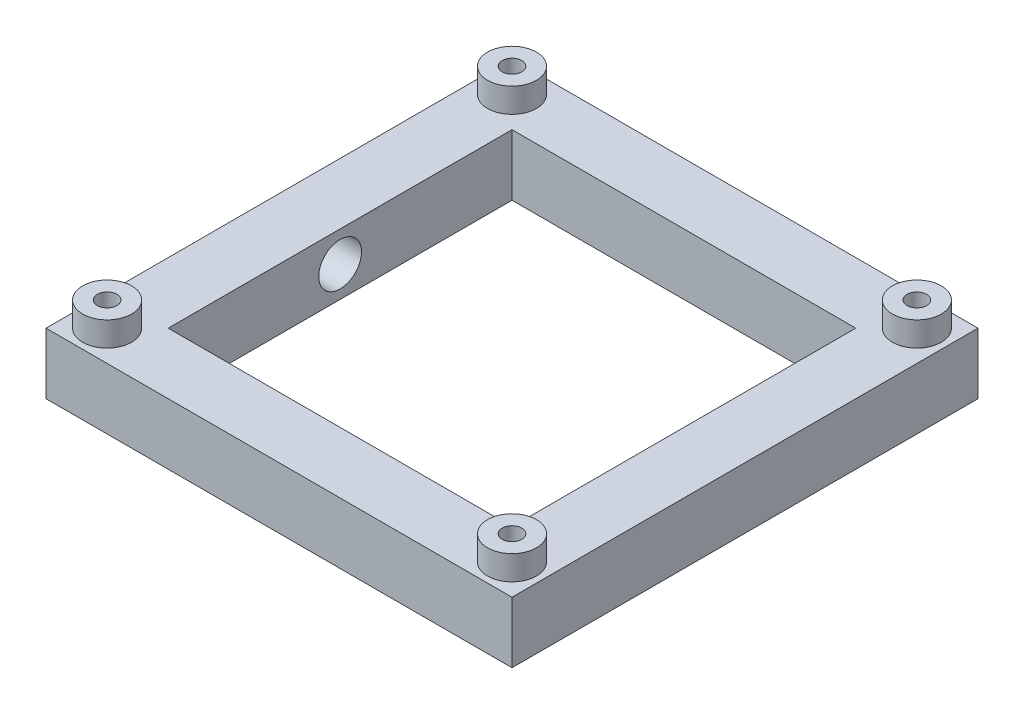
ISO-10303-21;
HEADER;
FILE_DESCRIPTION(('STEP AP214'),'2;1');
FILE_NAME('part.step','',(''),(''),'','','');
FILE_SCHEMA(('AUTOMOTIVE_DESIGN { 1 0 10303 214 1 1 1 1 }'));
ENDSEC;
DATA;
#1=APPLICATION_CONTEXT('core data for automotive mechanical design processes');
#2=APPLICATION_PROTOCOL_DEFINITION('international standard','automotive_design',2000,#1);
#3=PRODUCT_CONTEXT('',#1,'mechanical');
#4=PRODUCT('Part','Part','',(#3));
#5=PRODUCT_RELATED_PRODUCT_CATEGORY('part','',(#4));
#6=PRODUCT_DEFINITION_FORMATION('','',#4);
#7=PRODUCT_DEFINITION_CONTEXT('part definition',#1,'design');
#8=PRODUCT_DEFINITION('design','',#6,#7);
#9=PRODUCT_DEFINITION_SHAPE('','',#8);
#10=(LENGTH_UNIT() NAMED_UNIT(*) SI_UNIT(.MILLI.,.METRE.));
#11=(NAMED_UNIT(*) PLANE_ANGLE_UNIT() SI_UNIT($,.RADIAN.));
#12=(NAMED_UNIT(*) SI_UNIT($,.STERADIAN.) SOLID_ANGLE_UNIT());
#13=UNCERTAINTY_MEASURE_WITH_UNIT(LENGTH_MEASURE(1.E-05),#10,'distance_accuracy_value','');
#14=(GEOMETRIC_REPRESENTATION_CONTEXT(3) GLOBAL_UNCERTAINTY_ASSIGNED_CONTEXT((#13)) GLOBAL_UNIT_ASSIGNED_CONTEXT((#10,
#11,#12)) REPRESENTATION_CONTEXT('',''));
#15=CARTESIAN_POINT('',(0.,0.,0.));
#16=DIRECTION('',(0.,0.,1.));
#17=DIRECTION('',(1.,0.,0.));
#18=AXIS2_PLACEMENT_3D('',#15,#16,#17);
#19=CARTESIAN_POINT('',(0.,10.,0.));
#20=DIRECTION('',(0.,1.,0.));
#21=DIRECTION('',(0.,0.,1.));
#22=AXIS2_PLACEMENT_3D('',#19,#20,#21);
#23=PLANE('',#22);
#24=CARTESIAN_POINT('',(61.25,10.,61.25));
#25=DIRECTION('',(0.,1.,0.));
#26=DIRECTION('',(0.,0.,1.));
#27=AXIS2_PLACEMENT_3D('',#24,#25,#26);
#28=CIRCLE('',#27,4.00000000000001);
#29=CARTESIAN_POINT('',(61.25,10.,65.25));
#30=VERTEX_POINT('',#29);
#31=EDGE_CURVE('E245',#30,#30,#28,.T.);
#32=ORIENTED_EDGE('',*,*,#31,.F.);
#33=EDGE_LOOP('',(#32));
#34=FACE_BOUND('',#33,.T.);
#35=CARTESIAN_POINT('',(-5.,10.,-5.));
#36=DIRECTION('',(0.,1.,0.));
#37=DIRECTION('',(0.,0.,1.));
#38=AXIS2_PLACEMENT_3D('',#35,#36,#37);
#39=CIRCLE('',#38,4.);
#40=CARTESIAN_POINT('',(-5.,10.,-1.));
#41=VERTEX_POINT('',#40);
#42=EDGE_CURVE('E227',#41,#41,#39,.T.);
#43=ORIENTED_EDGE('',*,*,#42,.F.);
#44=EDGE_LOOP('',(#43));
#45=FACE_BOUND('',#44,.T.);
#46=DIRECTION('',(0.,0.,1.));
#47=VECTOR('',#46,1.);
#48=CARTESIAN_POINT('',(66.25,10.,0.));
#49=LINE('',#48,#47);
#50=CARTESIAN_POINT('',(66.25,10.,-10.));
#51=VERTEX_POINT('',#50);
#52=CARTESIAN_POINT('',(66.25,10.,66.25));
#53=VERTEX_POINT('',#52);
#54=EDGE_CURVE('E187',#51,#53,#49,.T.);
#55=ORIENTED_EDGE('',*,*,#54,.F.);
#56=DIRECTION('',(1.,0.,0.));
#57=VECTOR('',#56,1.);
#58=CARTESIAN_POINT('',(0.,10.,-10.));
#59=LINE('',#58,#57);
#60=CARTESIAN_POINT('',(-10.,10.,-10.));
#61=VERTEX_POINT('',#60);
#62=EDGE_CURVE('E202',#61,#51,#59,.T.);
#63=ORIENTED_EDGE('',*,*,#62,.F.);
#64=DIRECTION('',(0.,0.,1.));
#65=VECTOR('',#64,1.);
#66=CARTESIAN_POINT('',(-10.,10.,0.));
#67=LINE('',#66,#65);
#68=CARTESIAN_POINT('',(-9.99999999999999,10.,66.25));
#69=VERTEX_POINT('',#68);
#70=EDGE_CURVE('E215',#61,#69,#67,.T.);
#71=ORIENTED_EDGE('',*,*,#70,.T.);
#72=DIRECTION('',(1.,0.,0.));
#73=VECTOR('',#72,1.);
#74=CARTESIAN_POINT('',(0.,10.,66.25));
#75=LINE('',#74,#73);
#76=EDGE_CURVE('E213',#69,#53,#75,.T.);
#77=ORIENTED_EDGE('',*,*,#76,.T.);
#78=EDGE_LOOP('',(#55,#63,#71,#77));
#79=FACE_BOUND('',#78,.T.);
#80=DIRECTION('',(1.,0.,0.));
#81=VECTOR('',#80,1.);
#82=CARTESIAN_POINT('',(0.,10.,0.));
#83=LINE('',#82,#81);
#84=CARTESIAN_POINT('',(0.,10.,0.));
#85=VERTEX_POINT('',#84);
#86=CARTESIAN_POINT('',(56.25,10.,0.));
#87=VERTEX_POINT('',#86);
#88=EDGE_CURVE('E138',#85,#87,#83,.T.);
#89=ORIENTED_EDGE('',*,*,#88,.T.);
#90=DIRECTION('',(0.,0.,1.));
#91=VECTOR('',#90,1.);
#92=CARTESIAN_POINT('',(56.25,10.,0.));
#93=LINE('',#92,#91);
#94=CARTESIAN_POINT('',(56.25,10.,56.25));
#95=VERTEX_POINT('',#94);
#96=EDGE_CURVE('E132',#87,#95,#93,.T.);
#97=ORIENTED_EDGE('',*,*,#96,.T.);
#98=DIRECTION('',(1.,0.,0.));
#99=VECTOR('',#98,1.);
#100=CARTESIAN_POINT('',(0.,10.,56.25));
#101=LINE('',#100,#99);
#102=CARTESIAN_POINT('',(0.,10.,56.25));
#103=VERTEX_POINT('',#102);
#104=EDGE_CURVE('E137',#103,#95,#101,.T.);
#105=ORIENTED_EDGE('',*,*,#104,.F.);
#106=DIRECTION('',(0.,0.,1.));
#107=VECTOR('',#106,1.);
#108=CARTESIAN_POINT('',(0.,10.,0.));
#109=LINE('',#108,#107);
#110=EDGE_CURVE('E149',#85,#103,#109,.T.);
#111=ORIENTED_EDGE('',*,*,#110,.F.);
#112=EDGE_LOOP('',(#89,#97,#105,#111));
#113=FACE_BOUND('',#112,.T.);
#114=CARTESIAN_POINT('',(-4.99999999999999,10.,61.25));
#115=DIRECTION('',(0.,1.,0.));
#116=DIRECTION('',(0.,0.,1.));
#117=AXIS2_PLACEMENT_3D('',#114,#115,#116);
#118=CIRCLE('',#117,4.);
#119=CARTESIAN_POINT('',(-4.99999999999999,10.,65.25));
#120=VERTEX_POINT('',#119);
#121=EDGE_CURVE('E236',#120,#120,#118,.T.);
#122=ORIENTED_EDGE('',*,*,#121,.F.);
#123=EDGE_LOOP('',(#122));
#124=FACE_BOUND('',#123,.T.);
#125=CARTESIAN_POINT('',(61.25,10.,-5.));
#126=DIRECTION('',(0.,1.,0.));
#127=DIRECTION('',(0.,0.,1.));
#128=AXIS2_PLACEMENT_3D('',#125,#126,#127);
#129=CIRCLE('',#128,4.);
#130=CARTESIAN_POINT('',(61.25,10.,-1.));
#131=VERTEX_POINT('',#130);
#132=EDGE_CURVE('E254',#131,#131,#129,.T.);
#133=ORIENTED_EDGE('',*,*,#132,.F.);
#134=EDGE_LOOP('',(#133));
#135=FACE_BOUND('',#134,.T.);
#136=ADVANCED_FACE('F59',(#34,#45,#79,#113,#124,#135),#23,.T.);
#137=CARTESIAN_POINT('',(0.,10.,0.));
#138=DIRECTION('',(0.,0.,-1.));
#139=DIRECTION('',(-1.,0.,0.));
#140=AXIS2_PLACEMENT_3D('',#137,#138,#139);
#141=PLANE('',#140);
#142=DIRECTION('',(1.,0.,0.));
#143=VECTOR('',#142,1.);
#144=CARTESIAN_POINT('',(0.,0.,0.));
#145=LINE('',#144,#143);
#146=CARTESIAN_POINT('',(0.,0.,0.));
#147=VERTEX_POINT('',#146);
#148=CARTESIAN_POINT('',(56.25,0.,0.));
#149=VERTEX_POINT('',#148);
#150=EDGE_CURVE('E167',#147,#149,#145,.T.);
#151=ORIENTED_EDGE('',*,*,#150,.T.);
#152=DIRECTION('',(0.,-1.,0.));
#153=VECTOR('',#152,1.);
#154=CARTESIAN_POINT('',(56.25,10.,0.));
#155=LINE('',#154,#153);
#156=EDGE_CURVE('E12',#87,#149,#155,.T.);
#157=ORIENTED_EDGE('',*,*,#156,.F.);
#158=ORIENTED_EDGE('',*,*,#88,.F.);
#159=DIRECTION('',(0.,-1.,0.));
#160=VECTOR('',#159,1.);
#161=CARTESIAN_POINT('',(0.,10.,0.));
#162=LINE('',#161,#160);
#163=EDGE_CURVE('E78',#85,#147,#162,.T.);
#164=ORIENTED_EDGE('',*,*,#163,.T.);
#165=EDGE_LOOP('',(#151,#157,#158,#164));
#166=FACE_BOUND('',#165,.T.);
#167=ADVANCED_FACE('F281',(#166),#141,.F.);
#168=CARTESIAN_POINT('',(56.25,10.,0.));
#169=DIRECTION('',(1.,0.,0.));
#170=DIRECTION('',(0.,0.,-1.));
#171=AXIS2_PLACEMENT_3D('',#168,#169,#170);
#172=PLANE('',#171);
#173=DIRECTION('',(0.,0.,1.));
#174=VECTOR('',#173,1.);
#175=CARTESIAN_POINT('',(56.25,0.,0.));
#176=LINE('',#175,#174);
#177=CARTESIAN_POINT('',(56.25,0.,56.25));
#178=VERTEX_POINT('',#177);
#179=EDGE_CURVE('E144',#149,#178,#176,.T.);
#180=ORIENTED_EDGE('',*,*,#179,.T.);
#181=DIRECTION('',(0.,-1.,0.));
#182=VECTOR('',#181,1.);
#183=CARTESIAN_POINT('',(56.25,10.,56.25));
#184=LINE('',#183,#182);
#185=EDGE_CURVE('E69',#95,#178,#184,.T.);
#186=ORIENTED_EDGE('',*,*,#185,.F.);
#187=ORIENTED_EDGE('',*,*,#96,.F.);
#188=ORIENTED_EDGE('',*,*,#156,.T.);
#189=EDGE_LOOP('',(#180,#186,#187,#188));
#190=FACE_BOUND('',#189,.T.);
#191=ADVANCED_FACE('F143',(#190),#172,.F.);
#192=CARTESIAN_POINT('',(0.,10.,56.25));
#193=DIRECTION('',(0.,0.,-1.));
#194=DIRECTION('',(-1.,0.,0.));
#195=AXIS2_PLACEMENT_3D('',#192,#193,#194);
#196=PLANE('',#195);
#197=DIRECTION('',(1.,0.,0.));
#198=VECTOR('',#197,1.);
#199=CARTESIAN_POINT('',(0.,0.,56.25));
#200=LINE('',#199,#198);
#201=CARTESIAN_POINT('',(0.,0.,56.25));
#202=VERTEX_POINT('',#201);
#203=EDGE_CURVE('E170',#202,#178,#200,.T.);
#204=ORIENTED_EDGE('',*,*,#203,.F.);
#205=DIRECTION('',(0.,-1.,0.));
#206=VECTOR('',#205,1.);
#207=CARTESIAN_POINT('',(0.,10.,56.25));
#208=LINE('',#207,#206);
#209=EDGE_CURVE('E104',#103,#202,#208,.T.);
#210=ORIENTED_EDGE('',*,*,#209,.F.);
#211=ORIENTED_EDGE('',*,*,#104,.T.);
#212=ORIENTED_EDGE('',*,*,#185,.T.);
#213=EDGE_LOOP('',(#204,#210,#211,#212));
#214=FACE_BOUND('',#213,.T.);
#215=ADVANCED_FACE('F148',(#214),#196,.T.);
#216=CARTESIAN_POINT('',(66.25,10.,0.));
#217=DIRECTION('',(1.,0.,0.));
#218=DIRECTION('',(0.,0.,-1.));
#219=AXIS2_PLACEMENT_3D('',#216,#217,#218);
#220=PLANE('',#219);
#221=DIRECTION('',(0.,0.,1.));
#222=VECTOR('',#221,1.);
#223=CARTESIAN_POINT('',(66.25,0.,0.));
#224=LINE('',#223,#222);
#225=CARTESIAN_POINT('',(66.25,0.,-10.));
#226=VERTEX_POINT('',#225);
#227=CARTESIAN_POINT('',(66.25,0.,66.25));
#228=VERTEX_POINT('',#227);
#229=EDGE_CURVE('E155',#226,#228,#224,.T.);
#230=ORIENTED_EDGE('',*,*,#229,.F.);
#231=DIRECTION('',(0.,-1.,0.));
#232=VECTOR('',#231,1.);
#233=CARTESIAN_POINT('',(66.25,10.,-10.));
#234=LINE('',#233,#232);
#235=EDGE_CURVE('E63',#51,#226,#234,.T.);
#236=ORIENTED_EDGE('',*,*,#235,.F.);
#237=ORIENTED_EDGE('',*,*,#54,.T.);
#238=DIRECTION('',(0.,-1.,0.));
#239=VECTOR('',#238,1.);
#240=CARTESIAN_POINT('',(66.25,10.,66.25));
#241=LINE('',#240,#239);
#242=EDGE_CURVE('E151',#53,#228,#241,.T.);
#243=ORIENTED_EDGE('',*,*,#242,.T.);
#244=EDGE_LOOP('',(#230,#236,#237,#243));
#245=FACE_BOUND('',#244,.T.);
#246=ADVANCED_FACE('F61',(#245),#220,.T.);
#247=CARTESIAN_POINT('',(0.,10.,-10.));
#248=DIRECTION('',(0.,0.,-1.));
#249=DIRECTION('',(-1.,0.,0.));
#250=AXIS2_PLACEMENT_3D('',#247,#248,#249);
#251=PLANE('',#250);
#252=DIRECTION('',(1.,0.,0.));
#253=VECTOR('',#252,1.);
#254=CARTESIAN_POINT('',(0.,0.,-10.));
#255=LINE('',#254,#253);
#256=CARTESIAN_POINT('',(-10.,0.,-10.));
#257=VERTEX_POINT('',#256);
#258=EDGE_CURVE('E158',#257,#226,#255,.T.);
#259=ORIENTED_EDGE('',*,*,#258,.F.);
#260=DIRECTION('',(0.,-1.,0.));
#261=VECTOR('',#260,1.);
#262=CARTESIAN_POINT('',(-10.,10.,-10.));
#263=LINE('',#262,#261);
#264=EDGE_CURVE('E193',#61,#257,#263,.T.);
#265=ORIENTED_EDGE('',*,*,#264,.F.);
#266=ORIENTED_EDGE('',*,*,#62,.T.);
#267=ORIENTED_EDGE('',*,*,#235,.T.);
#268=EDGE_LOOP('',(#259,#265,#266,#267));
#269=FACE_BOUND('',#268,.T.);
#270=ADVANCED_FACE('F200',(#269),#251,.T.);
#271=CARTESIAN_POINT('',(-10.,10.,0.));
#272=DIRECTION('',(1.,0.,0.));
#273=DIRECTION('',(0.,0.,-1.));
#274=AXIS2_PLACEMENT_3D('',#271,#272,#273);
#275=PLANE('',#274);
#276=CARTESIAN_POINT('',(-10.,5.00000000000019,28.125));
#277=DIRECTION('',(1.,0.,0.));
#278=DIRECTION('',(0.,0.,-1.));
#279=AXIS2_PLACEMENT_3D('',#276,#277,#278);
#280=CIRCLE('',#279,3.5);
#281=CARTESIAN_POINT('',(-10.,5.00000000000019,24.625));
#282=VERTEX_POINT('',#281);
#283=EDGE_CURVE('E159',#282,#282,#280,.F.);
#284=ORIENTED_EDGE('',*,*,#283,.F.);
#285=EDGE_LOOP('',(#284));
#286=FACE_BOUND('',#285,.T.);
#287=DIRECTION('',(0.,0.,1.));
#288=VECTOR('',#287,1.);
#289=CARTESIAN_POINT('',(-10.,0.,0.));
#290=LINE('',#289,#288);
#291=CARTESIAN_POINT('',(-9.99999999999999,0.,66.25));
#292=VERTEX_POINT('',#291);
#293=EDGE_CURVE('E162',#257,#292,#290,.T.);
#294=ORIENTED_EDGE('',*,*,#293,.T.);
#295=DIRECTION('',(0.,-1.,0.));
#296=VECTOR('',#295,1.);
#297=CARTESIAN_POINT('',(-9.99999999999999,10.,66.25));
#298=LINE('',#297,#296);
#299=EDGE_CURVE('E191',#69,#292,#298,.T.);
#300=ORIENTED_EDGE('',*,*,#299,.F.);
#301=ORIENTED_EDGE('',*,*,#70,.F.);
#302=ORIENTED_EDGE('',*,*,#264,.T.);
#303=EDGE_LOOP('',(#294,#300,#301,#302));
#304=FACE_BOUND('',#303,.T.);
#305=ADVANCED_FACE('F209',(#286,#304),#275,.F.);
#306=CARTESIAN_POINT('',(-4.99999999999999,10.,61.25));
#307=DIRECTION('',(0.,-1.,0.));
#308=DIRECTION('',(0.,0.,-1.));
#309=AXIS2_PLACEMENT_3D('',#306,#307,#308);
#310=CYLINDRICAL_SURFACE('',#309,1.6);
#311=CARTESIAN_POINT('',(-4.99999999999999,0.,61.25));
#312=DIRECTION('',(0.,1.,0.));
#313=DIRECTION('',(0.,0.,1.));
#314=AXIS2_PLACEMENT_3D('',#311,#312,#313);
#315=CIRCLE('',#314,1.6);
#316=CARTESIAN_POINT('',(-4.99999999999999,0.,62.85));
#317=VERTEX_POINT('',#316);
#318=EDGE_CURVE('E181',#317,#317,#315,.T.);
#319=ORIENTED_EDGE('',*,*,#318,.F.);
#320=EDGE_LOOP('',(#319));
#321=FACE_BOUND('',#320,.T.);
#322=CARTESIAN_POINT('',(-4.99999999999999,14.,61.25));
#323=DIRECTION('',(0.,1.,0.));
#324=DIRECTION('',(0.,0.,1.));
#325=AXIS2_PLACEMENT_3D('',#322,#323,#324);
#326=CIRCLE('',#325,1.6);
#327=CARTESIAN_POINT('',(-4.99999999999999,14.,62.85));
#328=VERTEX_POINT('',#327);
#329=EDGE_CURVE('E239',#328,#328,#326,.T.);
#330=ORIENTED_EDGE('',*,*,#329,.T.);
#331=EDGE_LOOP('',(#330));
#332=FACE_BOUND('',#331,.T.);
#333=ADVANCED_FACE('F300',(#321,#332),#310,.F.);
#334=CARTESIAN_POINT('',(61.25,10.,61.25));
#335=DIRECTION('',(0.,-1.,0.));
#336=DIRECTION('',(0.,0.,-1.));
#337=AXIS2_PLACEMENT_3D('',#334,#335,#336);
#338=CYLINDRICAL_SURFACE('',#337,1.60000000000001);
#339=CARTESIAN_POINT('',(61.25,0.,61.25));
#340=DIRECTION('',(0.,1.,0.));
#341=DIRECTION('',(0.,0.,1.));
#342=AXIS2_PLACEMENT_3D('',#339,#340,#341);
#343=CIRCLE('',#342,1.60000000000001);
#344=CARTESIAN_POINT('',(61.25,0.,62.85));
#345=VERTEX_POINT('',#344);
#346=EDGE_CURVE('E178',#345,#345,#343,.T.);
#347=ORIENTED_EDGE('',*,*,#346,.F.);
#348=EDGE_LOOP('',(#347));
#349=FACE_BOUND('',#348,.T.);
#350=CARTESIAN_POINT('',(61.25,14.,61.25));
#351=DIRECTION('',(0.,1.,0.));
#352=DIRECTION('',(0.,0.,1.));
#353=AXIS2_PLACEMENT_3D('',#350,#351,#352);
#354=CIRCLE('',#353,1.60000000000001);
#355=CARTESIAN_POINT('',(61.25,14.,62.85));
#356=VERTEX_POINT('',#355);
#357=EDGE_CURVE('E248',#356,#356,#354,.T.);
#358=ORIENTED_EDGE('',*,*,#357,.T.);
#359=EDGE_LOOP('',(#358));
#360=FACE_BOUND('',#359,.T.);
#361=ADVANCED_FACE('F303',(#349,#360),#338,.F.);
#362=CARTESIAN_POINT('',(61.25,10.,-5.));
#363=DIRECTION('',(0.,-1.,0.));
#364=DIRECTION('',(0.,0.,-1.));
#365=AXIS2_PLACEMENT_3D('',#362,#363,#364);
#366=CYLINDRICAL_SURFACE('',#365,1.6);
#367=CARTESIAN_POINT('',(61.25,0.,-5.));
#368=DIRECTION('',(0.,1.,0.));
#369=DIRECTION('',(0.,0.,1.));
#370=AXIS2_PLACEMENT_3D('',#367,#368,#369);
#371=CIRCLE('',#370,1.6);
#372=CARTESIAN_POINT('',(61.25,0.,-3.4));
#373=VERTEX_POINT('',#372);
#374=EDGE_CURVE('E175',#373,#373,#371,.T.);
#375=ORIENTED_EDGE('',*,*,#374,.F.);
#376=EDGE_LOOP('',(#375));
#377=FACE_BOUND('',#376,.T.);
#378=CARTESIAN_POINT('',(61.25,14.,-5.));
#379=DIRECTION('',(0.,1.,0.));
#380=DIRECTION('',(0.,0.,1.));
#381=AXIS2_PLACEMENT_3D('',#378,#379,#380);
#382=CIRCLE('',#381,1.6);
#383=CARTESIAN_POINT('',(61.25,14.,-3.4));
#384=VERTEX_POINT('',#383);
#385=EDGE_CURVE('E257',#384,#384,#382,.T.);
#386=ORIENTED_EDGE('',*,*,#385,.T.);
#387=EDGE_LOOP('',(#386));
#388=FACE_BOUND('',#387,.T.);
#389=ADVANCED_FACE('F263',(#377,#388),#366,.F.);
#390=CARTESIAN_POINT('',(0.,10.,0.));
#391=DIRECTION('',(1.,0.,0.));
#392=DIRECTION('',(0.,0.,-1.));
#393=AXIS2_PLACEMENT_3D('',#390,#391,#392);
#394=PLANE('',#393);
#395=CARTESIAN_POINT('',(0.,5.00000000000019,28.125));
#396=DIRECTION('',(1.,0.,0.));
#397=DIRECTION('',(0.,0.,-1.));
#398=AXIS2_PLACEMENT_3D('',#395,#396,#397);
#399=CIRCLE('',#398,3.5);
#400=CARTESIAN_POINT('',(0.,5.00000000000019,24.625));
#401=VERTEX_POINT('',#400);
#402=EDGE_CURVE('E223',#401,#401,#399,.T.);
#403=ORIENTED_EDGE('',*,*,#402,.F.);
#404=EDGE_LOOP('',(#403));
#405=FACE_BOUND('',#404,.T.);
#406=DIRECTION('',(0.,0.,1.));
#407=VECTOR('',#406,1.);
#408=CARTESIAN_POINT('',(0.,0.,0.));
#409=LINE('',#408,#407);
#410=EDGE_CURVE('E172',#147,#202,#409,.T.);
#411=ORIENTED_EDGE('',*,*,#410,.F.);
#412=ORIENTED_EDGE('',*,*,#163,.F.);
#413=ORIENTED_EDGE('',*,*,#110,.T.);
#414=ORIENTED_EDGE('',*,*,#209,.T.);
#415=EDGE_LOOP('',(#411,#412,#413,#414));
#416=FACE_BOUND('',#415,.T.);
#417=ADVANCED_FACE('F310',(#405,#416),#394,.T.);
#418=CARTESIAN_POINT('',(0.,10.,66.25));
#419=DIRECTION('',(0.,0.,-1.));
#420=DIRECTION('',(-1.,0.,0.));
#421=AXIS2_PLACEMENT_3D('',#418,#419,#420);
#422=PLANE('',#421);
#423=DIRECTION('',(1.,0.,0.));
#424=VECTOR('',#423,1.);
#425=CARTESIAN_POINT('',(0.,0.,66.25));
#426=LINE('',#425,#424);
#427=EDGE_CURVE('E164',#292,#228,#426,.T.);
#428=ORIENTED_EDGE('',*,*,#427,.T.);
#429=ORIENTED_EDGE('',*,*,#242,.F.);
#430=ORIENTED_EDGE('',*,*,#76,.F.);
#431=ORIENTED_EDGE('',*,*,#299,.T.);
#432=EDGE_LOOP('',(#428,#429,#430,#431));
#433=FACE_BOUND('',#432,.T.);
#434=ADVANCED_FACE('F212',(#433),#422,.F.);
#435=CARTESIAN_POINT('',(-5.,10.,-5.));
#436=DIRECTION('',(0.,-1.,0.));
#437=DIRECTION('',(0.,0.,-1.));
#438=AXIS2_PLACEMENT_3D('',#435,#436,#437);
#439=CYLINDRICAL_SURFACE('',#438,1.6);
#440=CARTESIAN_POINT('',(-5.,0.,-5.));
#441=DIRECTION('',(0.,1.,0.));
#442=DIRECTION('',(0.,0.,1.));
#443=AXIS2_PLACEMENT_3D('',#440,#441,#442);
#444=CIRCLE('',#443,1.6);
#445=CARTESIAN_POINT('',(-5.,0.,-3.4));
#446=VERTEX_POINT('',#445);
#447=EDGE_CURVE('E184',#446,#446,#444,.T.);
#448=ORIENTED_EDGE('',*,*,#447,.F.);
#449=EDGE_LOOP('',(#448));
#450=FACE_BOUND('',#449,.T.);
#451=CARTESIAN_POINT('',(-5.,14.,-5.));
#452=DIRECTION('',(0.,1.,0.));
#453=DIRECTION('',(0.,0.,1.));
#454=AXIS2_PLACEMENT_3D('',#451,#452,#453);
#455=CIRCLE('',#454,1.6);
#456=CARTESIAN_POINT('',(-5.,14.,-3.4));
#457=VERTEX_POINT('',#456);
#458=EDGE_CURVE('E230',#457,#457,#455,.T.);
#459=ORIENTED_EDGE('',*,*,#458,.T.);
#460=EDGE_LOOP('',(#459));
#461=FACE_BOUND('',#460,.T.);
#462=ADVANCED_FACE('F296',(#450,#461),#439,.F.);
#463=CARTESIAN_POINT('',(0.,0.,0.));
#464=DIRECTION('',(0.,1.,0.));
#465=DIRECTION('',(0.,0.,1.));
#466=AXIS2_PLACEMENT_3D('',#463,#464,#465);
#467=PLANE('',#466);
#468=ORIENTED_EDGE('',*,*,#229,.T.);
#469=ORIENTED_EDGE('',*,*,#427,.F.);
#470=ORIENTED_EDGE('',*,*,#293,.F.);
#471=ORIENTED_EDGE('',*,*,#258,.T.);
#472=EDGE_LOOP('',(#468,#469,#470,#471));
#473=FACE_BOUND('',#472,.T.);
#474=ORIENTED_EDGE('',*,*,#150,.F.);
#475=ORIENTED_EDGE('',*,*,#410,.T.);
#476=ORIENTED_EDGE('',*,*,#203,.T.);
#477=ORIENTED_EDGE('',*,*,#179,.F.);
#478=EDGE_LOOP('',(#474,#475,#476,#477));
#479=FACE_BOUND('',#478,.T.);
#480=ORIENTED_EDGE('',*,*,#374,.T.);
#481=EDGE_LOOP('',(#480));
#482=FACE_BOUND('',#481,.T.);
#483=ORIENTED_EDGE('',*,*,#346,.T.);
#484=EDGE_LOOP('',(#483));
#485=FACE_BOUND('',#484,.T.);
#486=ORIENTED_EDGE('',*,*,#318,.T.);
#487=EDGE_LOOP('',(#486));
#488=FACE_BOUND('',#487,.T.);
#489=ORIENTED_EDGE('',*,*,#447,.T.);
#490=EDGE_LOOP('',(#489));
#491=FACE_BOUND('',#490,.T.);
#492=ADVANCED_FACE('F206',(#473,#479,#482,#485,#488,#491),#467,.F.);
#493=CARTESIAN_POINT('',(-19.8994949366117,5.00000000000019,28.125));
#494=DIRECTION('',(1.,0.,0.));
#495=DIRECTION('',(0.,0.,-1.));
#496=AXIS2_PLACEMENT_3D('',#493,#494,#495);
#497=CYLINDRICAL_SURFACE('',#496,3.5);
#498=ORIENTED_EDGE('',*,*,#283,.T.);
#499=EDGE_LOOP('',(#498));
#500=FACE_BOUND('',#499,.T.);
#501=ORIENTED_EDGE('',*,*,#402,.T.);
#502=EDGE_LOOP('',(#501));
#503=FACE_BOUND('',#502,.T.);
#504=ADVANCED_FACE('F292',(#500,#503),#497,.F.);
#505=CARTESIAN_POINT('',(-5.,14.,-5.));
#506=DIRECTION('',(0.,1.,0.));
#507=DIRECTION('',(0.,0.,1.));
#508=AXIS2_PLACEMENT_3D('',#505,#506,#507);
#509=PLANE('',#508);
#510=CARTESIAN_POINT('',(-5.,14.,-5.));
#511=DIRECTION('',(0.,1.,0.));
#512=DIRECTION('',(0.,0.,1.));
#513=AXIS2_PLACEMENT_3D('',#510,#511,#512);
#514=CIRCLE('',#513,4.);
#515=CARTESIAN_POINT('',(-5.,14.,-1.));
#516=VERTEX_POINT('',#515);
#517=EDGE_CURVE('E226',#516,#516,#514,.T.);
#518=ORIENTED_EDGE('',*,*,#517,.T.);
#519=EDGE_LOOP('',(#518));
#520=FACE_BOUND('',#519,.T.);
#521=ORIENTED_EDGE('',*,*,#458,.F.);
#522=EDGE_LOOP('',(#521));
#523=FACE_BOUND('',#522,.T.);
#524=ADVANCED_FACE('F423',(#520,#523),#509,.T.);
#525=CARTESIAN_POINT('',(-5.,14.,-5.));
#526=DIRECTION('',(0.,-1.,0.));
#527=DIRECTION('',(0.,0.,-1.));
#528=AXIS2_PLACEMENT_3D('',#525,#526,#527);
#529=CYLINDRICAL_SURFACE('',#528,4.);
#530=ORIENTED_EDGE('',*,*,#517,.F.);
#531=EDGE_LOOP('',(#530));
#532=FACE_BOUND('',#531,.T.);
#533=ORIENTED_EDGE('',*,*,#42,.T.);
#534=EDGE_LOOP('',(#533));
#535=FACE_BOUND('',#534,.T.);
#536=ADVANCED_FACE('F452',(#532,#535),#529,.T.);
#537=CARTESIAN_POINT('',(-4.99999999999999,14.,61.25));
#538=DIRECTION('',(0.,1.,0.));
#539=DIRECTION('',(0.,0.,1.));
#540=AXIS2_PLACEMENT_3D('',#537,#538,#539);
#541=PLANE('',#540);
#542=CARTESIAN_POINT('',(-4.99999999999999,14.,61.25));
#543=DIRECTION('',(0.,1.,0.));
#544=DIRECTION('',(0.,0.,1.));
#545=AXIS2_PLACEMENT_3D('',#542,#543,#544);
#546=CIRCLE('',#545,4.);
#547=CARTESIAN_POINT('',(-4.99999999999999,14.,65.25));
#548=VERTEX_POINT('',#547);
#549=EDGE_CURVE('E235',#548,#548,#546,.T.);
#550=ORIENTED_EDGE('',*,*,#549,.T.);
#551=EDGE_LOOP('',(#550));
#552=FACE_BOUND('',#551,.T.);
#553=ORIENTED_EDGE('',*,*,#329,.F.);
#554=EDGE_LOOP('',(#553));
#555=FACE_BOUND('',#554,.T.);
#556=ADVANCED_FACE('F462',(#552,#555),#541,.T.);
#557=CARTESIAN_POINT('',(-4.99999999999999,14.,61.25));
#558=DIRECTION('',(0.,-1.,0.));
#559=DIRECTION('',(0.,0.,-1.));
#560=AXIS2_PLACEMENT_3D('',#557,#558,#559);
#561=CYLINDRICAL_SURFACE('',#560,4.);
#562=ORIENTED_EDGE('',*,*,#549,.F.);
#563=EDGE_LOOP('',(#562));
#564=FACE_BOUND('',#563,.T.);
#565=ORIENTED_EDGE('',*,*,#121,.T.);
#566=EDGE_LOOP('',(#565));
#567=FACE_BOUND('',#566,.T.);
#568=ADVANCED_FACE('F471',(#564,#567),#561,.T.);
#569=CARTESIAN_POINT('',(61.25,14.,61.25));
#570=DIRECTION('',(0.,1.,0.));
#571=DIRECTION('',(0.,0.,1.));
#572=AXIS2_PLACEMENT_3D('',#569,#570,#571);
#573=PLANE('',#572);
#574=CARTESIAN_POINT('',(61.25,14.,61.25));
#575=DIRECTION('',(0.,1.,0.));
#576=DIRECTION('',(0.,0.,1.));
#577=AXIS2_PLACEMENT_3D('',#574,#575,#576);
#578=CIRCLE('',#577,4.00000000000001);
#579=CARTESIAN_POINT('',(61.25,14.,65.25));
#580=VERTEX_POINT('',#579);
#581=EDGE_CURVE('E244',#580,#580,#578,.T.);
#582=ORIENTED_EDGE('',*,*,#581,.T.);
#583=EDGE_LOOP('',(#582));
#584=FACE_BOUND('',#583,.T.);
#585=ORIENTED_EDGE('',*,*,#357,.F.);
#586=EDGE_LOOP('',(#585));
#587=FACE_BOUND('',#586,.T.);
#588=ADVANCED_FACE('F277',(#584,#587),#573,.T.);
#589=CARTESIAN_POINT('',(61.25,14.,61.25));
#590=DIRECTION('',(0.,-1.,0.));
#591=DIRECTION('',(0.,0.,-1.));
#592=AXIS2_PLACEMENT_3D('',#589,#590,#591);
#593=CYLINDRICAL_SURFACE('',#592,4.00000000000001);
#594=ORIENTED_EDGE('',*,*,#581,.F.);
#595=EDGE_LOOP('',(#594));
#596=FACE_BOUND('',#595,.T.);
#597=ORIENTED_EDGE('',*,*,#31,.T.);
#598=EDGE_LOOP('',(#597));
#599=FACE_BOUND('',#598,.T.);
#600=ADVANCED_FACE('F268',(#596,#599),#593,.T.);
#601=CARTESIAN_POINT('',(61.25,14.,-5.));
#602=DIRECTION('',(0.,1.,0.));
#603=DIRECTION('',(0.,0.,1.));
#604=AXIS2_PLACEMENT_3D('',#601,#602,#603);
#605=PLANE('',#604);
#606=CARTESIAN_POINT('',(61.25,14.,-5.));
#607=DIRECTION('',(0.,1.,0.));
#608=DIRECTION('',(0.,0.,1.));
#609=AXIS2_PLACEMENT_3D('',#606,#607,#608);
#610=CIRCLE('',#609,4.);
#611=CARTESIAN_POINT('',(61.25,14.,-1.));
#612=VERTEX_POINT('',#611);
#613=EDGE_CURVE('E253',#612,#612,#610,.T.);
#614=ORIENTED_EDGE('',*,*,#613,.T.);
#615=EDGE_LOOP('',(#614));
#616=FACE_BOUND('',#615,.T.);
#617=ORIENTED_EDGE('',*,*,#385,.F.);
#618=EDGE_LOOP('',(#617));
#619=FACE_BOUND('',#618,.T.);
#620=ADVANCED_FACE('F265',(#616,#619),#605,.T.);
#621=CARTESIAN_POINT('',(61.25,14.,-5.));
#622=DIRECTION('',(0.,-1.,0.));
#623=DIRECTION('',(0.,0.,-1.));
#624=AXIS2_PLACEMENT_3D('',#621,#622,#623);
#625=CYLINDRICAL_SURFACE('',#624,4.);
#626=ORIENTED_EDGE('',*,*,#613,.F.);
#627=EDGE_LOOP('',(#626));
#628=FACE_BOUND('',#627,.T.);
#629=ORIENTED_EDGE('',*,*,#132,.T.);
#630=EDGE_LOOP('',(#629));
#631=FACE_BOUND('',#630,.T.);
#632=ADVANCED_FACE('F267',(#628,#631),#625,.T.);
#633=CLOSED_SHELL('',(#136,#167,#191,#215,#246,#270,#305,#333,#361,#389,#417,#434,#462,#492,
#504,#524,#536,#556,#568,#588,#600,#620,#632));
#634=MANIFOLD_SOLID_BREP('B2',#633);
#635=ADVANCED_BREP_SHAPE_REPRESENTATION('',(#18,#634),#14);
#636=SHAPE_DEFINITION_REPRESENTATION(#9,#635);
ENDSEC;
END-ISO-10303-21;
